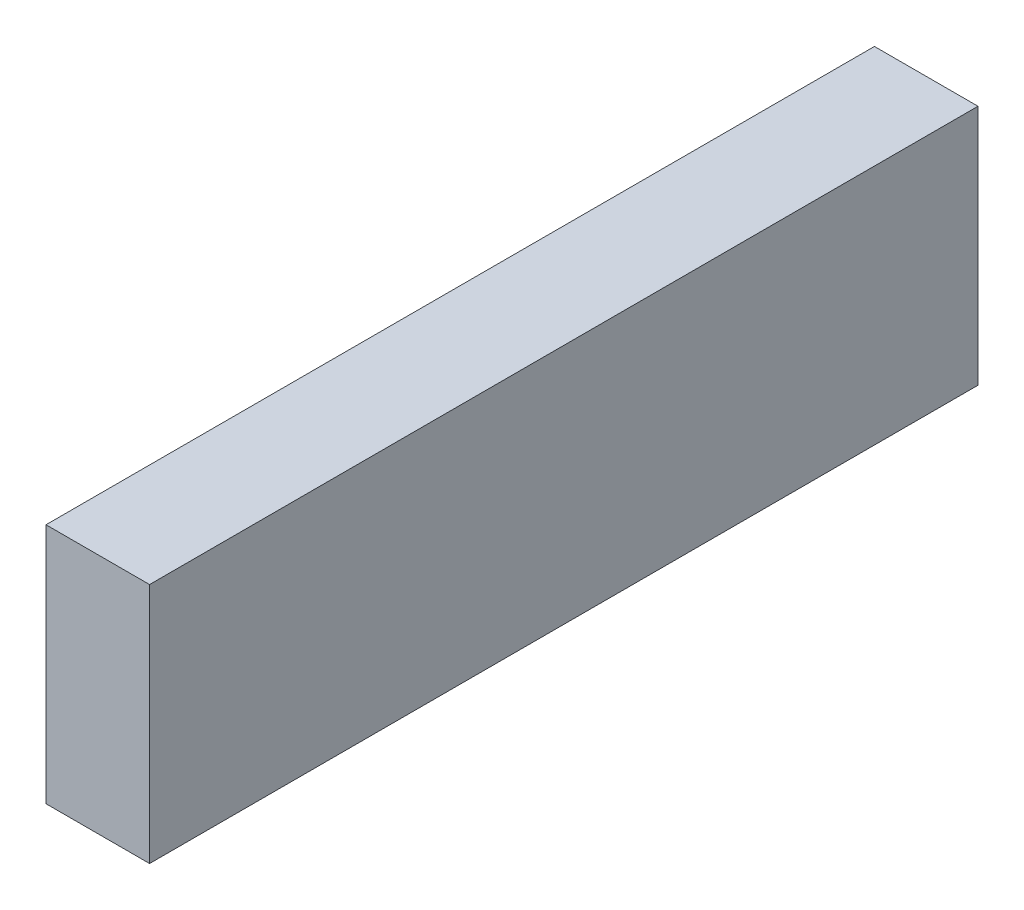
ISO-10303-21;
HEADER;
FILE_DESCRIPTION(('STEP AP214'),'2;1');
FILE_NAME('part.step','',(''),(''),'','','');
FILE_SCHEMA(('AUTOMOTIVE_DESIGN { 1 0 10303 214 1 1 1 1 }'));
ENDSEC;
DATA;
#1=APPLICATION_CONTEXT('core data for automotive mechanical design processes');
#2=APPLICATION_PROTOCOL_DEFINITION('international standard','automotive_design',2000,#1);
#3=PRODUCT_CONTEXT('',#1,'mechanical');
#4=PRODUCT('Part','Part','',(#3));
#5=PRODUCT_RELATED_PRODUCT_CATEGORY('part','',(#4));
#6=PRODUCT_DEFINITION_FORMATION('','',#4);
#7=PRODUCT_DEFINITION_CONTEXT('part definition',#1,'design');
#8=PRODUCT_DEFINITION('design','',#6,#7);
#9=PRODUCT_DEFINITION_SHAPE('','',#8);
#10=(LENGTH_UNIT() NAMED_UNIT(*) SI_UNIT(.MILLI.,.METRE.));
#11=(NAMED_UNIT(*) PLANE_ANGLE_UNIT() SI_UNIT($,.RADIAN.));
#12=(NAMED_UNIT(*) SI_UNIT($,.STERADIAN.) SOLID_ANGLE_UNIT());
#13=UNCERTAINTY_MEASURE_WITH_UNIT(LENGTH_MEASURE(1.E-05),#10,'distance_accuracy_value','');
#14=(GEOMETRIC_REPRESENTATION_CONTEXT(3) GLOBAL_UNCERTAINTY_ASSIGNED_CONTEXT((#13)) GLOBAL_UNIT_ASSIGNED_CONTEXT((#10,
#11,#12)) REPRESENTATION_CONTEXT('',''));
#15=CARTESIAN_POINT('',(0.,0.,0.));
#16=DIRECTION('',(0.,0.,1.));
#17=DIRECTION('',(1.,0.,0.));
#18=AXIS2_PLACEMENT_3D('',#15,#16,#17);
#19=CARTESIAN_POINT('',(0.,0.,304.8));
#20=DIRECTION('',(1.,0.,0.));
#21=DIRECTION('',(0.,0.,-1.));
#22=AXIS2_PLACEMENT_3D('',#19,#20,#21);
#23=PLANE('',#22);
#24=DIRECTION('',(0.,-1.,0.));
#25=VECTOR('',#24,1.);
#26=CARTESIAN_POINT('',(0.,0.,0.));
#27=LINE('',#26,#25);
#28=CARTESIAN_POINT('',(0.,88.9,0.));
#29=VERTEX_POINT('',#28);
#30=CARTESIAN_POINT('',(0.,0.,0.));
#31=VERTEX_POINT('',#30);
#32=EDGE_CURVE('E100',#29,#31,#27,.T.);
#33=ORIENTED_EDGE('',*,*,#32,.T.);
#34=DIRECTION('',(0.,0.,-1.));
#35=VECTOR('',#34,1.);
#36=CARTESIAN_POINT('',(0.,0.,304.8));
#37=LINE('',#36,#35);
#38=CARTESIAN_POINT('',(0.,0.,304.8));
#39=VERTEX_POINT('',#38);
#40=EDGE_CURVE('E11',#39,#31,#37,.T.);
#41=ORIENTED_EDGE('',*,*,#40,.F.);
#42=DIRECTION('',(0.,-1.,0.));
#43=VECTOR('',#42,1.);
#44=CARTESIAN_POINT('',(0.,0.,304.8));
#45=LINE('',#44,#43);
#46=CARTESIAN_POINT('',(0.,88.9,304.8));
#47=VERTEX_POINT('',#46);
#48=EDGE_CURVE('E88',#47,#39,#45,.T.);
#49=ORIENTED_EDGE('',*,*,#48,.F.);
#50=DIRECTION('',(0.,0.,-1.));
#51=VECTOR('',#50,1.);
#52=CARTESIAN_POINT('',(0.,88.9,304.8));
#53=LINE('',#52,#51);
#54=EDGE_CURVE('E96',#47,#29,#53,.T.);
#55=ORIENTED_EDGE('',*,*,#54,.T.);
#56=EDGE_LOOP('',(#33,#41,#49,#55));
#57=FACE_BOUND('',#56,.T.);
#58=ADVANCED_FACE('F37',(#57),#23,.F.);
#59=CARTESIAN_POINT('',(0.,0.,304.8));
#60=DIRECTION('',(0.,1.,0.));
#61=DIRECTION('',(0.,0.,1.));
#62=AXIS2_PLACEMENT_3D('',#59,#60,#61);
#63=PLANE('',#62);
#64=DIRECTION('',(1.,0.,0.));
#65=VECTOR('',#64,1.);
#66=CARTESIAN_POINT('',(0.,0.,0.));
#67=LINE('',#66,#65);
#68=CARTESIAN_POINT('',(38.1,0.,0.));
#69=VERTEX_POINT('',#68);
#70=EDGE_CURVE('E92',#31,#69,#67,.T.);
#71=ORIENTED_EDGE('',*,*,#70,.T.);
#72=DIRECTION('',(0.,0.,-1.));
#73=VECTOR('',#72,1.);
#74=CARTESIAN_POINT('',(38.1,0.,304.8));
#75=LINE('',#74,#73);
#76=CARTESIAN_POINT('',(38.1,0.,304.8));
#77=VERTEX_POINT('',#76);
#78=EDGE_CURVE('E45',#77,#69,#75,.T.);
#79=ORIENTED_EDGE('',*,*,#78,.F.);
#80=DIRECTION('',(1.,0.,0.));
#81=VECTOR('',#80,1.);
#82=CARTESIAN_POINT('',(0.,0.,304.8));
#83=LINE('',#82,#81);
#84=EDGE_CURVE('E83',#39,#77,#83,.T.);
#85=ORIENTED_EDGE('',*,*,#84,.F.);
#86=ORIENTED_EDGE('',*,*,#40,.T.);
#87=EDGE_LOOP('',(#71,#79,#85,#86));
#88=FACE_BOUND('',#87,.T.);
#89=ADVANCED_FACE('F91',(#88),#63,.F.);
#90=CARTESIAN_POINT('',(38.1,0.,304.8));
#91=DIRECTION('',(-1.,0.,0.));
#92=DIRECTION('',(0.,0.,1.));
#93=AXIS2_PLACEMENT_3D('',#90,#91,#92);
#94=PLANE('',#93);
#95=DIRECTION('',(0.,1.,0.));
#96=VECTOR('',#95,1.);
#97=CARTESIAN_POINT('',(38.1,0.,0.));
#98=LINE('',#97,#96);
#99=CARTESIAN_POINT('',(38.1,88.9,0.));
#100=VERTEX_POINT('',#99);
#101=EDGE_CURVE('E70',#69,#100,#98,.T.);
#102=ORIENTED_EDGE('',*,*,#101,.T.);
#103=DIRECTION('',(0.,0.,-1.));
#104=VECTOR('',#103,1.);
#105=CARTESIAN_POINT('',(38.1,88.9,304.8));
#106=LINE('',#105,#104);
#107=CARTESIAN_POINT('',(38.1,88.9,304.8));
#108=VERTEX_POINT('',#107);
#109=EDGE_CURVE('E93',#108,#100,#106,.T.);
#110=ORIENTED_EDGE('',*,*,#109,.F.);
#111=DIRECTION('',(0.,1.,0.));
#112=VECTOR('',#111,1.);
#113=CARTESIAN_POINT('',(38.1,0.,304.8));
#114=LINE('',#113,#112);
#115=EDGE_CURVE('E86',#77,#108,#114,.T.);
#116=ORIENTED_EDGE('',*,*,#115,.F.);
#117=ORIENTED_EDGE('',*,*,#78,.T.);
#118=EDGE_LOOP('',(#102,#110,#116,#117));
#119=FACE_BOUND('',#118,.T.);
#120=ADVANCED_FACE('F94',(#119),#94,.F.);
#121=CARTESIAN_POINT('',(0.,88.9,304.8));
#122=DIRECTION('',(0.,-1.,0.));
#123=DIRECTION('',(0.,0.,-1.));
#124=AXIS2_PLACEMENT_3D('',#121,#122,#123);
#125=PLANE('',#124);
#126=DIRECTION('',(-1.,0.,0.));
#127=VECTOR('',#126,1.);
#128=CARTESIAN_POINT('',(0.,88.9,0.));
#129=LINE('',#128,#127);
#130=EDGE_CURVE('E76',#100,#29,#129,.T.);
#131=ORIENTED_EDGE('',*,*,#130,.T.);
#132=ORIENTED_EDGE('',*,*,#54,.F.);
#133=DIRECTION('',(-1.,0.,0.));
#134=VECTOR('',#133,1.);
#135=CARTESIAN_POINT('',(0.,88.9,304.8));
#136=LINE('',#135,#134);
#137=EDGE_CURVE('E53',#108,#47,#136,.T.);
#138=ORIENTED_EDGE('',*,*,#137,.F.);
#139=ORIENTED_EDGE('',*,*,#109,.T.);
#140=EDGE_LOOP('',(#131,#132,#138,#139));
#141=FACE_BOUND('',#140,.T.);
#142=ADVANCED_FACE('F107',(#141),#125,.F.);
#143=CARTESIAN_POINT('',(0.,0.,304.8));
#144=DIRECTION('',(0.,0.,-1.));
#145=DIRECTION('',(-1.,0.,0.));
#146=AXIS2_PLACEMENT_3D('',#143,#144,#145);
#147=PLANE('',#146);
#148=ORIENTED_EDGE('',*,*,#48,.T.);
#149=ORIENTED_EDGE('',*,*,#84,.T.);
#150=ORIENTED_EDGE('',*,*,#115,.T.);
#151=ORIENTED_EDGE('',*,*,#137,.T.);
#152=EDGE_LOOP('',(#148,#149,#150,#151));
#153=FACE_BOUND('',#152,.T.);
#154=ADVANCED_FACE('F84',(#153),#147,.F.);
#155=CARTESIAN_POINT('',(0.,0.,0.));
#156=DIRECTION('',(0.,0.,-1.));
#157=DIRECTION('',(-1.,0.,0.));
#158=AXIS2_PLACEMENT_3D('',#155,#156,#157);
#159=PLANE('',#158);
#160=ORIENTED_EDGE('',*,*,#32,.F.);
#161=ORIENTED_EDGE('',*,*,#130,.F.);
#162=ORIENTED_EDGE('',*,*,#101,.F.);
#163=ORIENTED_EDGE('',*,*,#70,.F.);
#164=EDGE_LOOP('',(#160,#161,#162,#163));
#165=FACE_BOUND('',#164,.T.);
#166=ADVANCED_FACE('F110',(#165),#159,.T.);
#167=CLOSED_SHELL('',(#58,#89,#120,#142,#154,#166));
#168=MANIFOLD_SOLID_BREP('B2',#167);
#169=ADVANCED_BREP_SHAPE_REPRESENTATION('',(#18,#168),#14);
#170=SHAPE_DEFINITION_REPRESENTATION(#9,#169);
ENDSEC;
END-ISO-10303-21;
